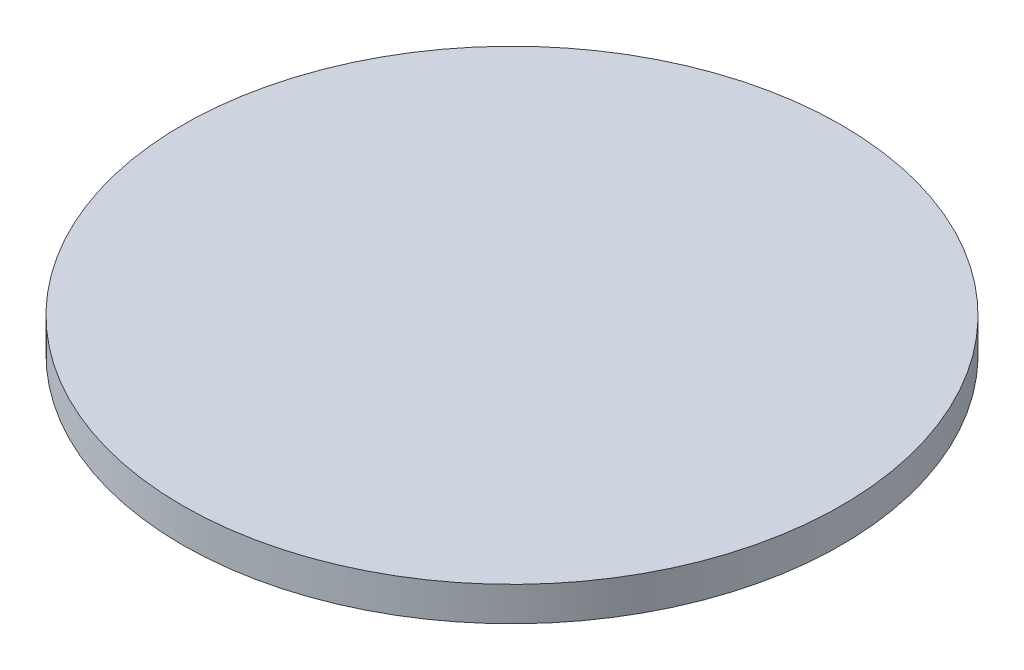
ISO-10303-21;
HEADER;
FILE_DESCRIPTION(('STEP AP214'),'2;1');
FILE_NAME('part.step','',(''),(''),'','','');
FILE_SCHEMA(('AUTOMOTIVE_DESIGN { 1 0 10303 214 1 1 1 1 }'));
ENDSEC;
DATA;
#1=APPLICATION_CONTEXT('core data for automotive mechanical design processes');
#2=APPLICATION_PROTOCOL_DEFINITION('international standard','automotive_design',2000,#1);
#3=PRODUCT_CONTEXT('',#1,'mechanical');
#4=PRODUCT('Part','Part','',(#3));
#5=PRODUCT_RELATED_PRODUCT_CATEGORY('part','',(#4));
#6=PRODUCT_DEFINITION_FORMATION('','',#4);
#7=PRODUCT_DEFINITION_CONTEXT('part definition',#1,'design');
#8=PRODUCT_DEFINITION('design','',#6,#7);
#9=PRODUCT_DEFINITION_SHAPE('','',#8);
#10=(LENGTH_UNIT() NAMED_UNIT(*) SI_UNIT(.MILLI.,.METRE.));
#11=(NAMED_UNIT(*) PLANE_ANGLE_UNIT() SI_UNIT($,.RADIAN.));
#12=(NAMED_UNIT(*) SI_UNIT($,.STERADIAN.) SOLID_ANGLE_UNIT());
#13=UNCERTAINTY_MEASURE_WITH_UNIT(LENGTH_MEASURE(1.E-05),#10,'distance_accuracy_value','');
#14=(GEOMETRIC_REPRESENTATION_CONTEXT(3) GLOBAL_UNCERTAINTY_ASSIGNED_CONTEXT((#13)) GLOBAL_UNIT_ASSIGNED_CONTEXT((#10,
#11,#12)) REPRESENTATION_CONTEXT('',''));
#15=CARTESIAN_POINT('',(0.,0.,0.));
#16=DIRECTION('',(0.,0.,1.));
#17=DIRECTION('',(1.,0.,0.));
#18=AXIS2_PLACEMENT_3D('',#15,#16,#17);
#19=CARTESIAN_POINT('',(0.,2.3,0.));
#20=DIRECTION('',(0.,-1.,0.));
#21=DIRECTION('',(0.,0.,-1.));
#22=AXIS2_PLACEMENT_3D('',#19,#20,#21);
#23=CYLINDRICAL_SURFACE('',#22,22.21);
#24=CARTESIAN_POINT('',(0.,2.3,0.));
#25=DIRECTION('',(0.,1.,0.));
#26=DIRECTION('',(0.,0.,1.));
#27=AXIS2_PLACEMENT_3D('',#24,#25,#26);
#28=CIRCLE('',#27,22.21);
#29=CARTESIAN_POINT('',(0.,2.3,22.21));
#30=VERTEX_POINT('',#29);
#31=EDGE_CURVE('E10',#30,#30,#28,.T.);
#32=ORIENTED_EDGE('',*,*,#31,.F.);
#33=EDGE_LOOP('',(#32));
#34=FACE_BOUND('',#33,.T.);
#35=CARTESIAN_POINT('',(0.,0.,0.));
#36=DIRECTION('',(0.,1.,0.));
#37=DIRECTION('',(0.,0.,1.));
#38=AXIS2_PLACEMENT_3D('',#35,#36,#37);
#39=CIRCLE('',#38,22.21);
#40=CARTESIAN_POINT('',(0.,0.,22.21));
#41=VERTEX_POINT('',#40);
#42=EDGE_CURVE('E40',#41,#41,#39,.T.);
#43=ORIENTED_EDGE('',*,*,#42,.T.);
#44=EDGE_LOOP('',(#43));
#45=FACE_BOUND('',#44,.T.);
#46=ADVANCED_FACE('F37',(#34,#45),#23,.T.);
#47=CARTESIAN_POINT('',(0.,2.3,0.));
#48=DIRECTION('',(0.,1.,0.));
#49=DIRECTION('',(0.,0.,1.));
#50=AXIS2_PLACEMENT_3D('',#47,#48,#49);
#51=PLANE('',#50);
#52=ORIENTED_EDGE('',*,*,#31,.T.);
#53=EDGE_LOOP('',(#52));
#54=FACE_BOUND('',#53,.T.);
#55=ADVANCED_FACE('F52',(#54),#51,.T.);
#56=CARTESIAN_POINT('',(0.,0.,0.));
#57=DIRECTION('',(0.,1.,0.));
#58=DIRECTION('',(0.,0.,1.));
#59=AXIS2_PLACEMENT_3D('',#56,#57,#58);
#60=PLANE('',#59);
#61=ORIENTED_EDGE('',*,*,#42,.F.);
#62=EDGE_LOOP('',(#61));
#63=FACE_BOUND('',#62,.T.);
#64=ADVANCED_FACE('F50',(#63),#60,.F.);
#65=CLOSED_SHELL('',(#46,#55,#64));
#66=MANIFOLD_SOLID_BREP('B2',#65);
#67=ADVANCED_BREP_SHAPE_REPRESENTATION('',(#18,#66),#14);
#68=SHAPE_DEFINITION_REPRESENTATION(#9,#67);
ENDSEC;
END-ISO-10303-21;
